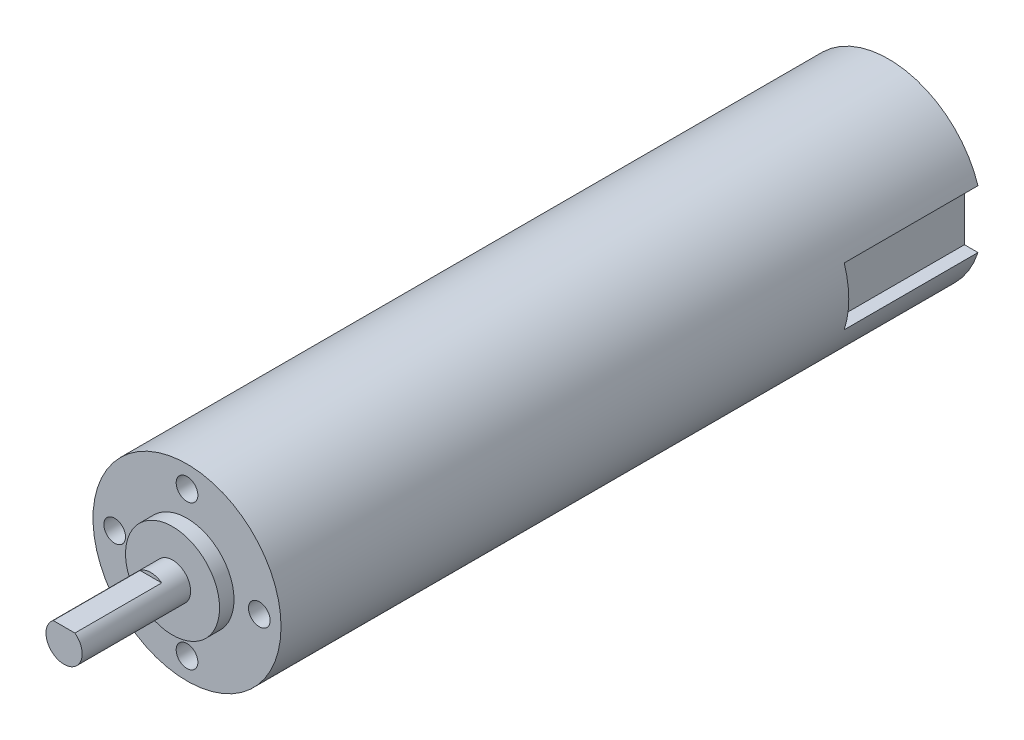
ISO-10303-21;
HEADER;
FILE_DESCRIPTION(('STEP AP214'),'2;1');
FILE_NAME('part.step','',(''),(''),'','','');
FILE_SCHEMA(('AUTOMOTIVE_DESIGN { 1 0 10303 214 1 1 1 1 }'));
ENDSEC;
DATA;
#1=APPLICATION_CONTEXT('core data for automotive mechanical design processes');
#2=APPLICATION_PROTOCOL_DEFINITION('international standard','automotive_design',2000,#1);
#3=PRODUCT_CONTEXT('',#1,'mechanical');
#4=PRODUCT('Part','Part','',(#3));
#5=PRODUCT_RELATED_PRODUCT_CATEGORY('part','',(#4));
#6=PRODUCT_DEFINITION_FORMATION('','',#4);
#7=PRODUCT_DEFINITION_CONTEXT('part definition',#1,'design');
#8=PRODUCT_DEFINITION('design','',#6,#7);
#9=PRODUCT_DEFINITION_SHAPE('','',#8);
#10=(LENGTH_UNIT() NAMED_UNIT(*) SI_UNIT(.MILLI.,.METRE.));
#11=(NAMED_UNIT(*) PLANE_ANGLE_UNIT() SI_UNIT($,.RADIAN.));
#12=(NAMED_UNIT(*) SI_UNIT($,.STERADIAN.) SOLID_ANGLE_UNIT());
#13=UNCERTAINTY_MEASURE_WITH_UNIT(LENGTH_MEASURE(1.E-05),#10,'distance_accuracy_value','');
#14=(GEOMETRIC_REPRESENTATION_CONTEXT(3) GLOBAL_UNCERTAINTY_ASSIGNED_CONTEXT((#13)) GLOBAL_UNIT_ASSIGNED_CONTEXT((#10,
#11,#12)) REPRESENTATION_CONTEXT('',''));
#15=CARTESIAN_POINT('',(0.,0.,0.));
#16=DIRECTION('',(0.,0.,1.));
#17=DIRECTION('',(1.,0.,0.));
#18=AXIS2_PLACEMENT_3D('',#15,#16,#17);
#19=CARTESIAN_POINT('',(0.,0.,97.));
#20=DIRECTION('',(0.,0.,1.));
#21=DIRECTION('',(1.,0.,0.));
#22=AXIS2_PLACEMENT_3D('',#19,#20,#21);
#23=PLANE('',#22);
#24=CARTESIAN_POINT('',(0.,10.,97.));
#25=DIRECTION('',(0.,0.,1.));
#26=DIRECTION('',(1.,0.,0.));
#27=AXIS2_PLACEMENT_3D('',#24,#25,#26);
#28=CIRCLE('',#27,1.5);
#29=CARTESIAN_POINT('',(1.5,10.,97.));
#30=VERTEX_POINT('',#29);
#31=EDGE_CURVE('E142',#30,#30,#28,.T.);
#32=ORIENTED_EDGE('',*,*,#31,.F.);
#33=EDGE_LOOP('',(#32));
#34=FACE_BOUND('',#33,.T.);
#35=CARTESIAN_POINT('',(-10.,0.,97.));
#36=DIRECTION('',(0.,0.,1.));
#37=DIRECTION('',(1.,0.,0.));
#38=AXIS2_PLACEMENT_3D('',#35,#36,#37);
#39=CIRCLE('',#38,1.5);
#40=CARTESIAN_POINT('',(-8.5,0.,97.));
#41=VERTEX_POINT('',#40);
#42=EDGE_CURVE('E148',#41,#41,#39,.T.);
#43=ORIENTED_EDGE('',*,*,#42,.F.);
#44=EDGE_LOOP('',(#43));
#45=FACE_BOUND('',#44,.T.);
#46=CARTESIAN_POINT('',(0.,-10.,97.));
#47=DIRECTION('',(0.,0.,1.));
#48=DIRECTION('',(1.,0.,0.));
#49=AXIS2_PLACEMENT_3D('',#46,#47,#48);
#50=CIRCLE('',#49,1.5);
#51=CARTESIAN_POINT('',(1.5,-10.,97.));
#52=VERTEX_POINT('',#51);
#53=EDGE_CURVE('E154',#52,#52,#50,.T.);
#54=ORIENTED_EDGE('',*,*,#53,.F.);
#55=EDGE_LOOP('',(#54));
#56=FACE_BOUND('',#55,.T.);
#57=CARTESIAN_POINT('',(10.,0.,97.));
#58=DIRECTION('',(0.,0.,1.));
#59=DIRECTION('',(1.,0.,0.));
#60=AXIS2_PLACEMENT_3D('',#57,#58,#59);
#61=CIRCLE('',#60,1.5);
#62=CARTESIAN_POINT('',(11.5,0.,97.));
#63=VERTEX_POINT('',#62);
#64=EDGE_CURVE('E130',#63,#63,#61,.T.);
#65=ORIENTED_EDGE('',*,*,#64,.F.);
#66=EDGE_LOOP('',(#65));
#67=FACE_BOUND('',#66,.T.);
#68=CARTESIAN_POINT('',(0.,0.,97.));
#69=DIRECTION('',(0.,0.,1.));
#70=DIRECTION('',(1.,0.,0.));
#71=AXIS2_PLACEMENT_3D('',#68,#69,#70);
#72=CIRCLE('',#71,13.);
#73=CARTESIAN_POINT('',(13.,0.,97.));
#74=VERTEX_POINT('',#73);
#75=EDGE_CURVE('E11',#74,#74,#72,.T.);
#76=ORIENTED_EDGE('',*,*,#75,.T.);
#77=EDGE_LOOP('',(#76));
#78=FACE_BOUND('',#77,.T.);
#79=CARTESIAN_POINT('',(0.,0.,97.));
#80=DIRECTION('',(0.,0.,1.));
#81=DIRECTION('',(1.,0.,0.));
#82=AXIS2_PLACEMENT_3D('',#79,#80,#81);
#83=CIRCLE('',#82,6.5);
#84=CARTESIAN_POINT('',(6.5,0.,97.));
#85=VERTEX_POINT('',#84);
#86=EDGE_CURVE('E161',#85,#85,#83,.T.);
#87=ORIENTED_EDGE('',*,*,#86,.F.);
#88=EDGE_LOOP('',(#87));
#89=FACE_BOUND('',#88,.T.);
#90=ADVANCED_FACE('F37',(#34,#45,#56,#67,#78,#89),#23,.T.);
#91=CARTESIAN_POINT('',(0.,0.,97.));
#92=DIRECTION('',(0.,0.,-1.));
#93=DIRECTION('',(-1.,0.,0.));
#94=AXIS2_PLACEMENT_3D('',#91,#92,#93);
#95=CYLINDRICAL_SURFACE('',#94,13.);
#96=CARTESIAN_POINT('',(0.,0.,18.5));
#97=DIRECTION('',(0.,0.,-1.));
#98=DIRECTION('',(-1.,0.,0.));
#99=AXIS2_PLACEMENT_3D('',#96,#97,#98);
#100=CIRCLE('',#99,13.);
#101=CARTESIAN_POINT('',(12.369316876853,4.,18.5));
#102=VERTEX_POINT('',#101);
#103=CARTESIAN_POINT('',(12.369316876853,-4.,18.5));
#104=VERTEX_POINT('',#103);
#105=EDGE_CURVE('E168',#102,#104,#100,.T.);
#106=ORIENTED_EDGE('',*,*,#105,.F.);
#107=DIRECTION('',(0.,0.,-1.));
#108=VECTOR('',#107,1.);
#109=CARTESIAN_POINT('',(12.369316876853,4.,18.5));
#110=LINE('',#109,#108);
#111=CARTESIAN_POINT('',(12.369316876853,4.,0.));
#112=VERTEX_POINT('',#111);
#113=EDGE_CURVE('E189',#102,#112,#110,.T.);
#114=ORIENTED_EDGE('',*,*,#113,.T.);
#115=CARTESIAN_POINT('',(0.,0.,0.));
#116=DIRECTION('',(0.,0.,1.));
#117=DIRECTION('',(1.,0.,0.));
#118=AXIS2_PLACEMENT_3D('',#115,#116,#117);
#119=CIRCLE('',#118,13.);
#120=CARTESIAN_POINT('',(-12.369316876853,4.,0.));
#121=VERTEX_POINT('',#120);
#122=EDGE_CURVE('E41',#112,#121,#119,.T.);
#123=ORIENTED_EDGE('',*,*,#122,.T.);
#124=DIRECTION('',(0.,0.,-1.));
#125=VECTOR('',#124,1.);
#126=CARTESIAN_POINT('',(-12.369316876853,4.,18.5));
#127=LINE('',#126,#125);
#128=CARTESIAN_POINT('',(-12.369316876853,4.,18.5));
#129=VERTEX_POINT('',#128);
#130=EDGE_CURVE('E216',#129,#121,#127,.T.);
#131=ORIENTED_EDGE('',*,*,#130,.F.);
#132=CARTESIAN_POINT('',(0.,0.,18.5));
#133=DIRECTION('',(0.,0.,-1.));
#134=DIRECTION('',(1.,0.,0.));
#135=AXIS2_PLACEMENT_3D('',#132,#133,#134);
#136=CIRCLE('',#135,13.);
#137=CARTESIAN_POINT('',(-12.3650078174607,-4.01330059603498,18.5));
#138=VERTEX_POINT('',#137);
#139=EDGE_CURVE('E204',#138,#129,#136,.T.);
#140=ORIENTED_EDGE('',*,*,#139,.F.);
#141=DIRECTION('',(0.,0.,-1.));
#142=VECTOR('',#141,1.);
#143=CARTESIAN_POINT('',(-12.3650078174607,-4.01330059603498,18.5));
#144=LINE('',#143,#142);
#145=CARTESIAN_POINT('',(-12.3650078174607,-4.01330059603498,0.));
#146=VERTEX_POINT('',#145);
#147=EDGE_CURVE('E218',#138,#146,#144,.T.);
#148=ORIENTED_EDGE('',*,*,#147,.T.);
#149=CARTESIAN_POINT('',(12.369316876853,-4.,0.));
#150=VERTEX_POINT('',#149);
#151=EDGE_CURVE('E222',#146,#150,#119,.T.);
#152=ORIENTED_EDGE('',*,*,#151,.T.);
#153=DIRECTION('',(0.,0.,-1.));
#154=VECTOR('',#153,1.);
#155=CARTESIAN_POINT('',(12.369316876853,-4.,18.5));
#156=LINE('',#155,#154);
#157=EDGE_CURVE('E180',#104,#150,#156,.T.);
#158=ORIENTED_EDGE('',*,*,#157,.F.);
#159=EDGE_LOOP('',(#106,#114,#123,#131,#140,#148,#152,#158));
#160=FACE_BOUND('',#159,.T.);
#161=ORIENTED_EDGE('',*,*,#75,.F.);
#162=EDGE_LOOP('',(#161));
#163=FACE_BOUND('',#162,.T.);
#164=ADVANCED_FACE('F39',(#160,#163),#95,.T.);
#165=CARTESIAN_POINT('',(0.,0.,0.));
#166=DIRECTION('',(0.,0.,1.));
#167=DIRECTION('',(1.,0.,0.));
#168=AXIS2_PLACEMENT_3D('',#165,#166,#167);
#169=PLANE('',#168);
#170=ORIENTED_EDGE('',*,*,#122,.F.);
#171=DIRECTION('',(1.,0.,0.));
#172=VECTOR('',#171,1.);
#173=CARTESIAN_POINT('',(10.5,4.,0.));
#174=LINE('',#173,#172);
#175=CARTESIAN_POINT('',(10.5,4.,0.));
#176=VERTEX_POINT('',#175);
#177=EDGE_CURVE('E172',#176,#112,#174,.T.);
#178=ORIENTED_EDGE('',*,*,#177,.F.);
#179=DIRECTION('',(0.,1.,0.));
#180=VECTOR('',#179,1.);
#181=CARTESIAN_POINT('',(10.5,0.,0.));
#182=LINE('',#181,#180);
#183=CARTESIAN_POINT('',(10.5,-4.,0.));
#184=VERTEX_POINT('',#183);
#185=EDGE_CURVE('E184',#184,#176,#182,.T.);
#186=ORIENTED_EDGE('',*,*,#185,.F.);
#187=DIRECTION('',(-1.,0.,0.));
#188=VECTOR('',#187,1.);
#189=CARTESIAN_POINT('',(10.5,-4.,0.));
#190=LINE('',#189,#188);
#191=EDGE_CURVE('E181',#150,#184,#190,.T.);
#192=ORIENTED_EDGE('',*,*,#191,.F.);
#193=ORIENTED_EDGE('',*,*,#151,.F.);
#194=DIRECTION('',(-0.999974570704306,-0.00713147563547531,0.));
#195=VECTOR('',#194,1.);
#196=CARTESIAN_POINT('',(-10.5,-4.,0.));
#197=LINE('',#196,#195);
#198=CARTESIAN_POINT('',(-10.5,-4.,0.));
#199=VERTEX_POINT('',#198);
#200=EDGE_CURVE('E165',#199,#146,#197,.T.);
#201=ORIENTED_EDGE('',*,*,#200,.F.);
#202=DIRECTION('',(0.,-1.,0.));
#203=VECTOR('',#202,1.);
#204=CARTESIAN_POINT('',(-10.5,0.,0.));
#205=LINE('',#204,#203);
#206=CARTESIAN_POINT('',(-10.5,4.,0.));
#207=VERTEX_POINT('',#206);
#208=EDGE_CURVE('E201',#207,#199,#205,.T.);
#209=ORIENTED_EDGE('',*,*,#208,.F.);
#210=DIRECTION('',(1.,0.,0.));
#211=VECTOR('',#210,1.);
#212=CARTESIAN_POINT('',(-10.5,4.,0.));
#213=LINE('',#212,#211);
#214=EDGE_CURVE('E211',#121,#207,#213,.T.);
#215=ORIENTED_EDGE('',*,*,#214,.F.);
#216=EDGE_LOOP('',(#170,#178,#186,#192,#193,#201,#209,#215));
#217=FACE_BOUND('',#216,.T.);
#218=ADVANCED_FACE('F237',(#217),#169,.F.);
#219=CARTESIAN_POINT('',(-10.5,0.,18.5));
#220=DIRECTION('',(1.,0.,0.));
#221=DIRECTION('',(0.,0.,-1.));
#222=AXIS2_PLACEMENT_3D('',#219,#220,#221);
#223=PLANE('',#222);
#224=ORIENTED_EDGE('',*,*,#208,.T.);
#225=DIRECTION('',(0.,0.,-1.));
#226=VECTOR('',#225,1.);
#227=CARTESIAN_POINT('',(-10.5,-4.,18.5));
#228=LINE('',#227,#226);
#229=CARTESIAN_POINT('',(-10.5,-4.,18.5));
#230=VERTEX_POINT('',#229);
#231=EDGE_CURVE('E60',#230,#199,#228,.T.);
#232=ORIENTED_EDGE('',*,*,#231,.F.);
#233=DIRECTION('',(0.,-1.,0.));
#234=VECTOR('',#233,1.);
#235=CARTESIAN_POINT('',(-10.5,0.,18.5));
#236=LINE('',#235,#234);
#237=CARTESIAN_POINT('',(-10.5,4.,18.5));
#238=VERTEX_POINT('',#237);
#239=EDGE_CURVE('E197',#238,#230,#236,.T.);
#240=ORIENTED_EDGE('',*,*,#239,.F.);
#241=DIRECTION('',(0.,0.,-1.));
#242=VECTOR('',#241,1.);
#243=CARTESIAN_POINT('',(-10.5,4.,18.5));
#244=LINE('',#243,#242);
#245=EDGE_CURVE('E185',#238,#207,#244,.T.);
#246=ORIENTED_EDGE('',*,*,#245,.T.);
#247=EDGE_LOOP('',(#224,#232,#240,#246));
#248=FACE_BOUND('',#247,.T.);
#249=ADVANCED_FACE('F277',(#248),#223,.F.);
#250=CARTESIAN_POINT('',(-10.5,4.,18.5));
#251=DIRECTION('',(0.,1.,0.));
#252=DIRECTION('',(-1.,0.,0.));
#253=AXIS2_PLACEMENT_3D('',#250,#251,#252);
#254=PLANE('',#253);
#255=ORIENTED_EDGE('',*,*,#214,.T.);
#256=ORIENTED_EDGE('',*,*,#245,.F.);
#257=DIRECTION('',(1.,0.,0.));
#258=VECTOR('',#257,1.);
#259=CARTESIAN_POINT('',(-10.5,4.,18.5));
#260=LINE('',#259,#258);
#261=EDGE_CURVE('E207',#129,#238,#260,.T.);
#262=ORIENTED_EDGE('',*,*,#261,.F.);
#263=ORIENTED_EDGE('',*,*,#130,.T.);
#264=EDGE_LOOP('',(#255,#256,#262,#263));
#265=FACE_BOUND('',#264,.T.);
#266=ADVANCED_FACE('F243',(#265),#254,.F.);
#267=CARTESIAN_POINT('',(-10.5,-4.,18.5));
#268=DIRECTION('',(0.00713147563547531,-0.999974570704306,0.));
#269=DIRECTION('',(0.999974570704306,0.00713147563547531,0.));
#270=AXIS2_PLACEMENT_3D('',#267,#268,#269);
#271=PLANE('',#270);
#272=ORIENTED_EDGE('',*,*,#200,.T.);
#273=ORIENTED_EDGE('',*,*,#147,.F.);
#274=DIRECTION('',(-0.999974570704306,-0.00713147563547531,0.));
#275=VECTOR('',#274,1.);
#276=CARTESIAN_POINT('',(-10.5,-4.,18.5));
#277=LINE('',#276,#275);
#278=EDGE_CURVE('E200',#230,#138,#277,.T.);
#279=ORIENTED_EDGE('',*,*,#278,.F.);
#280=ORIENTED_EDGE('',*,*,#231,.T.);
#281=EDGE_LOOP('',(#272,#273,#279,#280));
#282=FACE_BOUND('',#281,.T.);
#283=ADVANCED_FACE('F286',(#282),#271,.F.);
#284=CARTESIAN_POINT('',(0.,0.,18.5));
#285=DIRECTION('',(0.,0.,1.));
#286=DIRECTION('',(1.,0.,0.));
#287=AXIS2_PLACEMENT_3D('',#284,#285,#286);
#288=PLANE('',#287);
#289=ORIENTED_EDGE('',*,*,#239,.T.);
#290=ORIENTED_EDGE('',*,*,#278,.T.);
#291=ORIENTED_EDGE('',*,*,#139,.T.);
#292=ORIENTED_EDGE('',*,*,#261,.T.);
#293=EDGE_LOOP('',(#289,#290,#291,#292));
#294=FACE_BOUND('',#293,.T.);
#295=ADVANCED_FACE('F245',(#294),#288,.F.);
#296=CARTESIAN_POINT('',(10.5,4.,18.5));
#297=DIRECTION('',(0.,1.,0.));
#298=DIRECTION('',(0.,0.,1.));
#299=AXIS2_PLACEMENT_3D('',#296,#297,#298);
#300=PLANE('',#299);
#301=ORIENTED_EDGE('',*,*,#177,.T.);
#302=ORIENTED_EDGE('',*,*,#113,.F.);
#303=DIRECTION('',(1.,0.,0.));
#304=VECTOR('',#303,1.);
#305=CARTESIAN_POINT('',(10.5,4.,18.5));
#306=LINE('',#305,#304);
#307=CARTESIAN_POINT('',(10.5,4.,18.5));
#308=VERTEX_POINT('',#307);
#309=EDGE_CURVE('E177',#308,#102,#306,.T.);
#310=ORIENTED_EDGE('',*,*,#309,.F.);
#311=DIRECTION('',(0.,0.,-1.));
#312=VECTOR('',#311,1.);
#313=CARTESIAN_POINT('',(10.5,4.,18.5));
#314=LINE('',#313,#312);
#315=EDGE_CURVE('E192',#308,#176,#314,.T.);
#316=ORIENTED_EDGE('',*,*,#315,.T.);
#317=EDGE_LOOP('',(#301,#302,#310,#316));
#318=FACE_BOUND('',#317,.T.);
#319=ADVANCED_FACE('F255',(#318),#300,.F.);
#320=CARTESIAN_POINT('',(10.5,0.,18.5));
#321=DIRECTION('',(-1.,0.,0.));
#322=DIRECTION('',(0.,0.,1.));
#323=AXIS2_PLACEMENT_3D('',#320,#321,#322);
#324=PLANE('',#323);
#325=ORIENTED_EDGE('',*,*,#185,.T.);
#326=ORIENTED_EDGE('',*,*,#315,.F.);
#327=DIRECTION('',(0.,1.,0.));
#328=VECTOR('',#327,1.);
#329=CARTESIAN_POINT('',(10.5,0.,18.5));
#330=LINE('',#329,#328);
#331=CARTESIAN_POINT('',(10.5,-4.,18.5));
#332=VERTEX_POINT('',#331);
#333=EDGE_CURVE('E175',#332,#308,#330,.T.);
#334=ORIENTED_EDGE('',*,*,#333,.F.);
#335=DIRECTION('',(0.,0.,-1.));
#336=VECTOR('',#335,1.);
#337=CARTESIAN_POINT('',(10.5,-4.,18.5));
#338=LINE('',#337,#336);
#339=EDGE_CURVE('E194',#332,#184,#338,.T.);
#340=ORIENTED_EDGE('',*,*,#339,.T.);
#341=EDGE_LOOP('',(#325,#326,#334,#340));
#342=FACE_BOUND('',#341,.T.);
#343=ADVANCED_FACE('F257',(#342),#324,.F.);
#344=CARTESIAN_POINT('',(10.5,-4.,18.5));
#345=DIRECTION('',(0.,-1.,0.));
#346=DIRECTION('',(0.,0.,-1.));
#347=AXIS2_PLACEMENT_3D('',#344,#345,#346);
#348=PLANE('',#347);
#349=ORIENTED_EDGE('',*,*,#191,.T.);
#350=ORIENTED_EDGE('',*,*,#339,.F.);
#351=DIRECTION('',(-1.,0.,0.));
#352=VECTOR('',#351,1.);
#353=CARTESIAN_POINT('',(10.5,-4.,18.5));
#354=LINE('',#353,#352);
#355=EDGE_CURVE('E171',#104,#332,#354,.T.);
#356=ORIENTED_EDGE('',*,*,#355,.F.);
#357=ORIENTED_EDGE('',*,*,#157,.T.);
#358=EDGE_LOOP('',(#349,#350,#356,#357));
#359=FACE_BOUND('',#358,.T.);
#360=ADVANCED_FACE('F248',(#359),#348,.F.);
#361=CARTESIAN_POINT('',(0.,0.,18.5));
#362=DIRECTION('',(0.,0.,-1.));
#363=DIRECTION('',(-1.,0.,0.));
#364=AXIS2_PLACEMENT_3D('',#361,#362,#363);
#365=PLANE('',#364);
#366=ORIENTED_EDGE('',*,*,#105,.T.);
#367=ORIENTED_EDGE('',*,*,#355,.T.);
#368=ORIENTED_EDGE('',*,*,#333,.T.);
#369=ORIENTED_EDGE('',*,*,#309,.T.);
#370=EDGE_LOOP('',(#366,#367,#368,#369));
#371=FACE_BOUND('',#370,.T.);
#372=ADVANCED_FACE('F251',(#371),#365,.T.);
#373=CARTESIAN_POINT('',(0.,0.,99.));
#374=DIRECTION('',(0.,0.,1.));
#375=DIRECTION('',(1.,0.,0.));
#376=AXIS2_PLACEMENT_3D('',#373,#374,#375);
#377=PLANE('',#376);
#378=CARTESIAN_POINT('',(0.,0.,99.));
#379=DIRECTION('',(0.,0.,1.));
#380=DIRECTION('',(1.,0.,0.));
#381=AXIS2_PLACEMENT_3D('',#378,#379,#380);
#382=CIRCLE('',#381,6.5);
#383=CARTESIAN_POINT('',(6.5,0.,99.));
#384=VERTEX_POINT('',#383);
#385=EDGE_CURVE('E162',#384,#384,#382,.T.);
#386=ORIENTED_EDGE('',*,*,#385,.T.);
#387=EDGE_LOOP('',(#386));
#388=FACE_BOUND('',#387,.T.);
#389=CARTESIAN_POINT('',(0.,0.,99.));
#390=DIRECTION('',(0.,0.,1.));
#391=DIRECTION('',(1.,0.,0.));
#392=AXIS2_PLACEMENT_3D('',#389,#390,#391);
#393=CIRCLE('',#392,2.5);
#394=CARTESIAN_POINT('',(2.5,0.,99.));
#395=VERTEX_POINT('',#394);
#396=EDGE_CURVE('E141',#395,#395,#393,.T.);
#397=ORIENTED_EDGE('',*,*,#396,.F.);
#398=EDGE_LOOP('',(#397));
#399=FACE_BOUND('',#398,.T.);
#400=ADVANCED_FACE('F299',(#388,#399),#377,.T.);
#401=CARTESIAN_POINT('',(0.,0.,99.));
#402=DIRECTION('',(0.,0.,-1.));
#403=DIRECTION('',(-1.,0.,0.));
#404=AXIS2_PLACEMENT_3D('',#401,#402,#403);
#405=CYLINDRICAL_SURFACE('',#404,6.5);
#406=ORIENTED_EDGE('',*,*,#385,.F.);
#407=EDGE_LOOP('',(#406));
#408=FACE_BOUND('',#407,.T.);
#409=ORIENTED_EDGE('',*,*,#86,.T.);
#410=EDGE_LOOP('',(#409));
#411=FACE_BOUND('',#410,.T.);
#412=ADVANCED_FACE('F293',(#408,#411),#405,.T.);
#413=CARTESIAN_POINT('',(0.,0.,114.));
#414=DIRECTION('',(0.,0.,1.));
#415=DIRECTION('',(1.,0.,0.));
#416=AXIS2_PLACEMENT_3D('',#413,#414,#415);
#417=PLANE('',#416);
#418=DIRECTION('',(1.,0.,0.));
#419=VECTOR('',#418,1.);
#420=CARTESIAN_POINT('',(0.,2.,114.));
#421=LINE('',#420,#419);
#422=CARTESIAN_POINT('',(-1.5,2.,114.));
#423=VERTEX_POINT('',#422);
#424=CARTESIAN_POINT('',(1.5,2.,114.));
#425=VERTEX_POINT('',#424);
#426=EDGE_CURVE('E120',#423,#425,#421,.T.);
#427=ORIENTED_EDGE('',*,*,#426,.F.);
#428=CARTESIAN_POINT('',(0.,0.,114.));
#429=DIRECTION('',(0.,0.,1.));
#430=DIRECTION('',(1.,0.,0.));
#431=AXIS2_PLACEMENT_3D('',#428,#429,#430);
#432=CIRCLE('',#431,2.5);
#433=EDGE_CURVE('E129',#423,#425,#432,.T.);
#434=ORIENTED_EDGE('',*,*,#433,.T.);
#435=EDGE_LOOP('',(#427,#434));
#436=FACE_BOUND('',#435,.T.);
#437=ADVANCED_FACE('F291',(#436),#417,.T.);
#438=CARTESIAN_POINT('',(0.,0.,114.));
#439=DIRECTION('',(0.,0.,-1.));
#440=DIRECTION('',(-1.,0.,0.));
#441=AXIS2_PLACEMENT_3D('',#438,#439,#440);
#442=CYLINDRICAL_SURFACE('',#441,2.5);
#443=ORIENTED_EDGE('',*,*,#433,.F.);
#444=DIRECTION('',(0.,0.,1.));
#445=VECTOR('',#444,1.);
#446=CARTESIAN_POINT('',(-1.5,2.,102.));
#447=LINE('',#446,#445);
#448=CARTESIAN_POINT('',(-1.5,2.,102.));
#449=VERTEX_POINT('',#448);
#450=EDGE_CURVE('E115',#449,#423,#447,.T.);
#451=ORIENTED_EDGE('',*,*,#450,.F.);
#452=CARTESIAN_POINT('',(0.,0.,102.));
#453=DIRECTION('',(0.,0.,1.));
#454=DIRECTION('',(-1.,0.,0.));
#455=AXIS2_PLACEMENT_3D('',#452,#453,#454);
#456=CIRCLE('',#455,2.5);
#457=CARTESIAN_POINT('',(1.5,2.,102.));
#458=VERTEX_POINT('',#457);
#459=EDGE_CURVE('E119',#458,#449,#456,.T.);
#460=ORIENTED_EDGE('',*,*,#459,.F.);
#461=DIRECTION('',(0.,0.,1.));
#462=VECTOR('',#461,1.);
#463=CARTESIAN_POINT('',(1.5,2.,102.));
#464=LINE('',#463,#462);
#465=EDGE_CURVE('E52',#458,#425,#464,.T.);
#466=ORIENTED_EDGE('',*,*,#465,.T.);
#467=EDGE_LOOP('',(#443,#451,#460,#466));
#468=FACE_BOUND('',#467,.T.);
#469=ORIENTED_EDGE('',*,*,#396,.T.);
#470=EDGE_LOOP('',(#469));
#471=FACE_BOUND('',#470,.T.);
#472=ADVANCED_FACE('F126',(#468,#471),#442,.T.);
#473=CARTESIAN_POINT('',(10.,0.,93.));
#474=DIRECTION('',(0.,0.,1.));
#475=DIRECTION('',(1.,0.,0.));
#476=AXIS2_PLACEMENT_3D('',#473,#474,#475);
#477=CYLINDRICAL_SURFACE('',#476,1.5);
#478=CARTESIAN_POINT('',(10.,0.,93.));
#479=DIRECTION('',(0.,0.,1.));
#480=DIRECTION('',(1.,0.,0.));
#481=AXIS2_PLACEMENT_3D('',#478,#479,#480);
#482=CIRCLE('',#481,1.5);
#483=CARTESIAN_POINT('',(11.5,0.,93.));
#484=VERTEX_POINT('',#483);
#485=EDGE_CURVE('E133',#484,#484,#482,.T.);
#486=ORIENTED_EDGE('',*,*,#485,.F.);
#487=EDGE_LOOP('',(#486));
#488=FACE_BOUND('',#487,.T.);
#489=ORIENTED_EDGE('',*,*,#64,.T.);
#490=EDGE_LOOP('',(#489));
#491=FACE_BOUND('',#490,.T.);
#492=ADVANCED_FACE('F298',(#488,#491),#477,.F.);
#493=CARTESIAN_POINT('',(10.,0.,93.));
#494=DIRECTION('',(0.,0.,1.));
#495=DIRECTION('',(1.,0.,0.));
#496=AXIS2_PLACEMENT_3D('',#493,#494,#495);
#497=PLANE('',#496);
#498=ORIENTED_EDGE('',*,*,#485,.T.);
#499=EDGE_LOOP('',(#498));
#500=FACE_BOUND('',#499,.T.);
#501=ADVANCED_FACE('F337',(#500),#497,.T.);
#502=CARTESIAN_POINT('',(0.,-10.,93.));
#503=DIRECTION('',(0.,0.,1.));
#504=DIRECTION('',(1.,0.,0.));
#505=AXIS2_PLACEMENT_3D('',#502,#503,#504);
#506=CYLINDRICAL_SURFACE('',#505,1.5);
#507=CARTESIAN_POINT('',(0.,-10.,93.));
#508=DIRECTION('',(0.,0.,1.));
#509=DIRECTION('',(1.,0.,0.));
#510=AXIS2_PLACEMENT_3D('',#507,#508,#509);
#511=CIRCLE('',#510,1.5);
#512=CARTESIAN_POINT('',(1.5,-10.,93.));
#513=VERTEX_POINT('',#512);
#514=EDGE_CURVE('E151',#513,#513,#511,.T.);
#515=ORIENTED_EDGE('',*,*,#514,.F.);
#516=EDGE_LOOP('',(#515));
#517=FACE_BOUND('',#516,.T.);
#518=ORIENTED_EDGE('',*,*,#53,.T.);
#519=EDGE_LOOP('',(#518));
#520=FACE_BOUND('',#519,.T.);
#521=ADVANCED_FACE('F346',(#517,#520),#506,.F.);
#522=CARTESIAN_POINT('',(0.,-10.,93.));
#523=DIRECTION('',(0.,0.,1.));
#524=DIRECTION('',(1.,0.,0.));
#525=AXIS2_PLACEMENT_3D('',#522,#523,#524);
#526=PLANE('',#525);
#527=ORIENTED_EDGE('',*,*,#514,.T.);
#528=EDGE_LOOP('',(#527));
#529=FACE_BOUND('',#528,.T.);
#530=ADVANCED_FACE('F356',(#529),#526,.T.);
#531=CARTESIAN_POINT('',(-10.,0.,93.));
#532=DIRECTION('',(0.,0.,1.));
#533=DIRECTION('',(1.,0.,0.));
#534=AXIS2_PLACEMENT_3D('',#531,#532,#533);
#535=CYLINDRICAL_SURFACE('',#534,1.5);
#536=CARTESIAN_POINT('',(-10.,0.,93.));
#537=DIRECTION('',(0.,0.,1.));
#538=DIRECTION('',(1.,0.,0.));
#539=AXIS2_PLACEMENT_3D('',#536,#537,#538);
#540=CIRCLE('',#539,1.5);
#541=CARTESIAN_POINT('',(-8.5,0.,93.));
#542=VERTEX_POINT('',#541);
#543=EDGE_CURVE('E145',#542,#542,#540,.T.);
#544=ORIENTED_EDGE('',*,*,#543,.F.);
#545=EDGE_LOOP('',(#544));
#546=FACE_BOUND('',#545,.T.);
#547=ORIENTED_EDGE('',*,*,#42,.T.);
#548=EDGE_LOOP('',(#547));
#549=FACE_BOUND('',#548,.T.);
#550=ADVANCED_FACE('F366',(#546,#549),#535,.F.);
#551=CARTESIAN_POINT('',(-10.,0.,93.));
#552=DIRECTION('',(0.,0.,1.));
#553=DIRECTION('',(1.,0.,0.));
#554=AXIS2_PLACEMENT_3D('',#551,#552,#553);
#555=PLANE('',#554);
#556=ORIENTED_EDGE('',*,*,#543,.T.);
#557=EDGE_LOOP('',(#556));
#558=FACE_BOUND('',#557,.T.);
#559=ADVANCED_FACE('F376',(#558),#555,.T.);
#560=CARTESIAN_POINT('',(0.,10.,93.));
#561=DIRECTION('',(0.,0.,1.));
#562=DIRECTION('',(1.,0.,0.));
#563=AXIS2_PLACEMENT_3D('',#560,#561,#562);
#564=CYLINDRICAL_SURFACE('',#563,1.5);
#565=CARTESIAN_POINT('',(0.,10.,93.));
#566=DIRECTION('',(0.,0.,1.));
#567=DIRECTION('',(1.,0.,0.));
#568=AXIS2_PLACEMENT_3D('',#565,#566,#567);
#569=CIRCLE('',#568,1.5);
#570=CARTESIAN_POINT('',(1.5,10.,93.));
#571=VERTEX_POINT('',#570);
#572=EDGE_CURVE('E138',#571,#571,#569,.T.);
#573=ORIENTED_EDGE('',*,*,#572,.F.);
#574=EDGE_LOOP('',(#573));
#575=FACE_BOUND('',#574,.T.);
#576=ORIENTED_EDGE('',*,*,#31,.T.);
#577=EDGE_LOOP('',(#576));
#578=FACE_BOUND('',#577,.T.);
#579=ADVANCED_FACE('F386',(#575,#578),#564,.F.);
#580=CARTESIAN_POINT('',(0.,10.,93.));
#581=DIRECTION('',(0.,0.,1.));
#582=DIRECTION('',(1.,0.,0.));
#583=AXIS2_PLACEMENT_3D('',#580,#581,#582);
#584=PLANE('',#583);
#585=ORIENTED_EDGE('',*,*,#572,.T.);
#586=EDGE_LOOP('',(#585));
#587=FACE_BOUND('',#586,.T.);
#588=ADVANCED_FACE('F396',(#587),#584,.T.);
#589=CARTESIAN_POINT('',(0.,2.,102.));
#590=DIRECTION('',(0.,-1.,0.));
#591=DIRECTION('',(0.,0.,-1.));
#592=AXIS2_PLACEMENT_3D('',#589,#590,#591);
#593=PLANE('',#592);
#594=ORIENTED_EDGE('',*,*,#426,.T.);
#595=ORIENTED_EDGE('',*,*,#465,.F.);
#596=DIRECTION('',(1.,0.,0.));
#597=VECTOR('',#596,1.);
#598=CARTESIAN_POINT('',(0.,2.,102.));
#599=LINE('',#598,#597);
#600=EDGE_CURVE('E111',#449,#458,#599,.T.);
#601=ORIENTED_EDGE('',*,*,#600,.F.);
#602=ORIENTED_EDGE('',*,*,#450,.T.);
#603=EDGE_LOOP('',(#594,#595,#601,#602));
#604=FACE_BOUND('',#603,.T.);
#605=ADVANCED_FACE('F113',(#604),#593,.F.);
#606=CARTESIAN_POINT('',(0.,0.,102.));
#607=DIRECTION('',(0.,0.,-1.));
#608=DIRECTION('',(-1.,0.,0.));
#609=AXIS2_PLACEMENT_3D('',#606,#607,#608);
#610=PLANE('',#609);
#611=ORIENTED_EDGE('',*,*,#600,.T.);
#612=ORIENTED_EDGE('',*,*,#459,.T.);
#613=EDGE_LOOP('',(#611,#612));
#614=FACE_BOUND('',#613,.T.);
#615=ADVANCED_FACE('F122',(#614),#610,.F.);
#616=CLOSED_SHELL('',(#90,#164,#218,#249,#266,#283,#295,#319,#343,#360,#372,#400,#412,#437,#472,
#492,#501,#521,#530,#550,#559,#579,#588,#605,#615));
#617=MANIFOLD_SOLID_BREP('B2',#616);
#618=ADVANCED_BREP_SHAPE_REPRESENTATION('',(#18,#617),#14);
#619=SHAPE_DEFINITION_REPRESENTATION(#9,#618);
ENDSEC;
END-ISO-10303-21;
